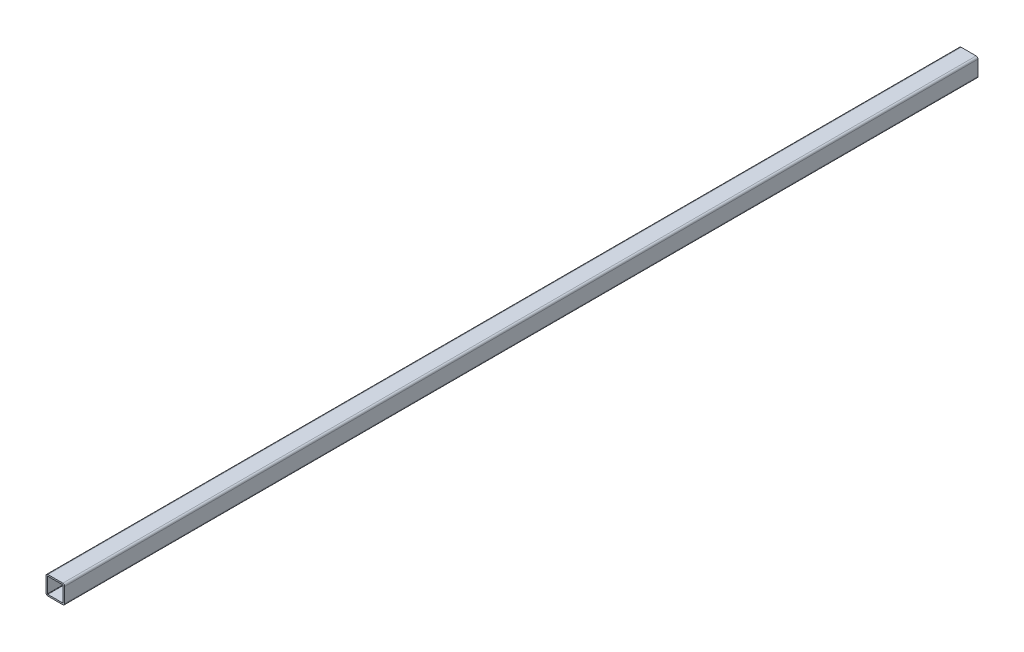
ISO-10303-21;
HEADER;
FILE_DESCRIPTION(('STEP AP214'),'2;1');
FILE_NAME('part.step','',(''),(''),'','','');
FILE_SCHEMA(('AUTOMOTIVE_DESIGN { 1 0 10303 214 1 1 1 1 }'));
ENDSEC;
DATA;
#1=APPLICATION_CONTEXT('core data for automotive mechanical design processes');
#2=APPLICATION_PROTOCOL_DEFINITION('international standard','automotive_design',2000,#1);
#3=PRODUCT_CONTEXT('',#1,'mechanical');
#4=PRODUCT('Part','Part','',(#3));
#5=PRODUCT_RELATED_PRODUCT_CATEGORY('part','',(#4));
#6=PRODUCT_DEFINITION_FORMATION('','',#4);
#7=PRODUCT_DEFINITION_CONTEXT('part definition',#1,'design');
#8=PRODUCT_DEFINITION('design','',#6,#7);
#9=PRODUCT_DEFINITION_SHAPE('','',#8);
#10=(LENGTH_UNIT() NAMED_UNIT(*) SI_UNIT(.MILLI.,.METRE.));
#11=(NAMED_UNIT(*) PLANE_ANGLE_UNIT() SI_UNIT($,.RADIAN.));
#12=(NAMED_UNIT(*) SI_UNIT($,.STERADIAN.) SOLID_ANGLE_UNIT());
#13=UNCERTAINTY_MEASURE_WITH_UNIT(LENGTH_MEASURE(1.E-05),#10,'distance_accuracy_value','');
#14=(GEOMETRIC_REPRESENTATION_CONTEXT(3) GLOBAL_UNCERTAINTY_ASSIGNED_CONTEXT((#13)) GLOBAL_UNIT_ASSIGNED_CONTEXT((#10,
#11,#12)) REPRESENTATION_CONTEXT('',''));
#15=CARTESIAN_POINT('',(0.,0.,0.));
#16=DIRECTION('',(0.,0.,1.));
#17=DIRECTION('',(1.,0.,0.));
#18=AXIS2_PLACEMENT_3D('',#15,#16,#17);
#19=CARTESIAN_POINT('',(-10.,10.,609.6));
#20=DIRECTION('',(0.,0.,1.));
#21=DIRECTION('',(1.,0.,0.));
#22=AXIS2_PLACEMENT_3D('',#19,#20,#21);
#23=PLANE('',#22);
#24=CARTESIAN_POINT('',(-10.,10.,609.6));
#25=DIRECTION('',(0.,0.,1.));
#26=DIRECTION('',(1.,0.,0.));
#27=AXIS2_PLACEMENT_3D('',#24,#25,#26);
#28=CIRCLE('',#27,2.5);
#29=CARTESIAN_POINT('',(-10.,12.5,609.6));
#30=VERTEX_POINT('',#29);
#31=CARTESIAN_POINT('',(-12.5,10.,609.6));
#32=VERTEX_POINT('',#31);
#33=EDGE_CURVE('E256',#30,#32,#28,.T.);
#34=ORIENTED_EDGE('',*,*,#33,.T.);
#35=DIRECTION('',(0.,-1.,0.));
#36=VECTOR('',#35,1.);
#37=CARTESIAN_POINT('',(-12.5,-10.,609.6));
#38=LINE('',#37,#36);
#39=CARTESIAN_POINT('',(-12.5,-10.,609.6));
#40=VERTEX_POINT('',#39);
#41=EDGE_CURVE('E259',#32,#40,#38,.T.);
#42=ORIENTED_EDGE('',*,*,#41,.T.);
#43=CARTESIAN_POINT('',(-10.,-10.,609.6));
#44=DIRECTION('',(0.,0.,1.));
#45=DIRECTION('',(-1.,0.,0.));
#46=AXIS2_PLACEMENT_3D('',#43,#44,#45);
#47=CIRCLE('',#46,2.5);
#48=CARTESIAN_POINT('',(-10.,-12.5,609.6));
#49=VERTEX_POINT('',#48);
#50=EDGE_CURVE('E262',#40,#49,#47,.T.);
#51=ORIENTED_EDGE('',*,*,#50,.T.);
#52=DIRECTION('',(1.,0.,0.));
#53=VECTOR('',#52,1.);
#54=CARTESIAN_POINT('',(10.,-12.5,609.6));
#55=LINE('',#54,#53);
#56=CARTESIAN_POINT('',(10.,-12.5,609.6));
#57=VERTEX_POINT('',#56);
#58=EDGE_CURVE('E264',#49,#57,#55,.T.);
#59=ORIENTED_EDGE('',*,*,#58,.T.);
#60=CARTESIAN_POINT('',(10.,-10.,609.6));
#61=DIRECTION('',(0.,0.,1.));
#62=DIRECTION('',(1.,0.,0.));
#63=AXIS2_PLACEMENT_3D('',#60,#61,#62);
#64=CIRCLE('',#63,2.5);
#65=CARTESIAN_POINT('',(12.5,-10.,609.6));
#66=VERTEX_POINT('',#65);
#67=EDGE_CURVE('E266',#57,#66,#64,.T.);
#68=ORIENTED_EDGE('',*,*,#67,.T.);
#69=DIRECTION('',(0.,1.,0.));
#70=VECTOR('',#69,1.);
#71=CARTESIAN_POINT('',(12.5,-10.,609.6));
#72=LINE('',#71,#70);
#73=CARTESIAN_POINT('',(12.5,10.,609.6));
#74=VERTEX_POINT('',#73);
#75=EDGE_CURVE('E268',#66,#74,#72,.T.);
#76=ORIENTED_EDGE('',*,*,#75,.T.);
#77=CARTESIAN_POINT('',(10.,10.,609.6));
#78=DIRECTION('',(0.,0.,1.));
#79=DIRECTION('',(1.,0.,0.));
#80=AXIS2_PLACEMENT_3D('',#77,#78,#79);
#81=CIRCLE('',#80,2.5);
#82=CARTESIAN_POINT('',(10.,12.5,609.6));
#83=VERTEX_POINT('',#82);
#84=EDGE_CURVE('E270',#74,#83,#81,.T.);
#85=ORIENTED_EDGE('',*,*,#84,.T.);
#86=DIRECTION('',(-1.,0.,0.));
#87=VECTOR('',#86,1.);
#88=CARTESIAN_POINT('',(10.,12.5,609.6));
#89=LINE('',#88,#87);
#90=EDGE_CURVE('E272',#83,#30,#89,.T.);
#91=ORIENTED_EDGE('',*,*,#90,.T.);
#92=EDGE_LOOP('',(#34,#42,#51,#59,#68,#76,#85,#91));
#93=FACE_BOUND('',#92,.T.);
#94=DIRECTION('',(0.,-1.,0.));
#95=VECTOR('',#94,1.);
#96=CARTESIAN_POINT('',(-10.5,-10.,609.6));
#97=LINE('',#96,#95);
#98=CARTESIAN_POINT('',(-10.5,10.,609.6));
#99=VERTEX_POINT('',#98);
#100=CARTESIAN_POINT('',(-10.5,-10.,609.6));
#101=VERTEX_POINT('',#100);
#102=EDGE_CURVE('E199',#99,#101,#97,.T.);
#103=ORIENTED_EDGE('',*,*,#102,.F.);
#104=CARTESIAN_POINT('',(-10.,10.,609.6));
#105=DIRECTION('',(0.,0.,1.));
#106=DIRECTION('',(1.,0.,0.));
#107=AXIS2_PLACEMENT_3D('',#104,#105,#106);
#108=CIRCLE('',#107,0.5);
#109=CARTESIAN_POINT('',(-10.,10.5,609.6));
#110=VERTEX_POINT('',#109);
#111=EDGE_CURVE('E191',#110,#99,#108,.T.);
#112=ORIENTED_EDGE('',*,*,#111,.F.);
#113=DIRECTION('',(-1.,0.,0.));
#114=VECTOR('',#113,1.);
#115=CARTESIAN_POINT('',(10.,10.5,609.6));
#116=LINE('',#115,#114);
#117=CARTESIAN_POINT('',(10.,10.5,609.6));
#118=VERTEX_POINT('',#117);
#119=EDGE_CURVE('E224',#118,#110,#116,.T.);
#120=ORIENTED_EDGE('',*,*,#119,.F.);
#121=CARTESIAN_POINT('',(10.,10.,609.6));
#122=DIRECTION('',(0.,0.,1.));
#123=DIRECTION('',(1.,0.,0.));
#124=AXIS2_PLACEMENT_3D('',#121,#122,#123);
#125=CIRCLE('',#124,0.499999999999997);
#126=CARTESIAN_POINT('',(10.5,10.,609.6));
#127=VERTEX_POINT('',#126);
#128=EDGE_CURVE('E222',#127,#118,#125,.T.);
#129=ORIENTED_EDGE('',*,*,#128,.F.);
#130=DIRECTION('',(0.,1.,0.));
#131=VECTOR('',#130,1.);
#132=CARTESIAN_POINT('',(10.5,-10.,609.6));
#133=LINE('',#132,#131);
#134=CARTESIAN_POINT('',(10.5,-10.,609.6));
#135=VERTEX_POINT('',#134);
#136=EDGE_CURVE('E220',#135,#127,#133,.T.);
#137=ORIENTED_EDGE('',*,*,#136,.F.);
#138=CARTESIAN_POINT('',(10.,-10.,609.6));
#139=DIRECTION('',(0.,0.,1.));
#140=DIRECTION('',(1.,0.,0.));
#141=AXIS2_PLACEMENT_3D('',#138,#139,#140);
#142=CIRCLE('',#141,0.499999999999999);
#143=CARTESIAN_POINT('',(10.,-10.5,609.6));
#144=VERTEX_POINT('',#143);
#145=EDGE_CURVE('E218',#144,#135,#142,.T.);
#146=ORIENTED_EDGE('',*,*,#145,.F.);
#147=DIRECTION('',(1.,0.,0.));
#148=VECTOR('',#147,1.);
#149=CARTESIAN_POINT('',(10.,-10.5,609.6));
#150=LINE('',#149,#148);
#151=CARTESIAN_POINT('',(-10.,-10.5,609.6));
#152=VERTEX_POINT('',#151);
#153=EDGE_CURVE('E214',#152,#144,#150,.T.);
#154=ORIENTED_EDGE('',*,*,#153,.F.);
#155=CARTESIAN_POINT('',(-10.,-10.,609.6));
#156=DIRECTION('',(0.,0.,1.));
#157=DIRECTION('',(1.,0.,0.));
#158=AXIS2_PLACEMENT_3D('',#155,#156,#157);
#159=CIRCLE('',#158,0.500000000000001);
#160=EDGE_CURVE('E212',#101,#152,#159,.T.);
#161=ORIENTED_EDGE('',*,*,#160,.F.);
#162=EDGE_LOOP('',(#103,#112,#120,#129,#137,#146,#154,#161));
#163=FACE_BOUND('',#162,.T.);
#164=ADVANCED_FACE('F78',(#93,#163),#23,.T.);
#165=CARTESIAN_POINT('',(-10.,10.,-609.6));
#166=DIRECTION('',(0.,0.,1.));
#167=DIRECTION('',(1.,0.,0.));
#168=AXIS2_PLACEMENT_3D('',#165,#166,#167);
#169=PLANE('',#168);
#170=CARTESIAN_POINT('',(-10.,10.,-609.6));
#171=DIRECTION('',(0.,0.,1.));
#172=DIRECTION('',(1.,0.,0.));
#173=AXIS2_PLACEMENT_3D('',#170,#171,#172);
#174=CIRCLE('',#173,2.5);
#175=CARTESIAN_POINT('',(-10.,12.5,-609.6));
#176=VERTEX_POINT('',#175);
#177=CARTESIAN_POINT('',(-12.5,10.,-609.6));
#178=VERTEX_POINT('',#177);
#179=EDGE_CURVE('E207',#176,#178,#174,.T.);
#180=ORIENTED_EDGE('',*,*,#179,.F.);
#181=DIRECTION('',(-1.,0.,0.));
#182=VECTOR('',#181,1.);
#183=CARTESIAN_POINT('',(10.,12.5,-609.6));
#184=LINE('',#183,#182);
#185=CARTESIAN_POINT('',(10.,12.5,-609.6));
#186=VERTEX_POINT('',#185);
#187=EDGE_CURVE('E260',#186,#176,#184,.T.);
#188=ORIENTED_EDGE('',*,*,#187,.F.);
#189=CARTESIAN_POINT('',(10.,10.,-609.6));
#190=DIRECTION('',(0.,0.,1.));
#191=DIRECTION('',(1.,0.,0.));
#192=AXIS2_PLACEMENT_3D('',#189,#190,#191);
#193=CIRCLE('',#192,2.5);
#194=CARTESIAN_POINT('',(12.5,10.,-609.6));
#195=VERTEX_POINT('',#194);
#196=EDGE_CURVE('E287',#195,#186,#193,.T.);
#197=ORIENTED_EDGE('',*,*,#196,.F.);
#198=DIRECTION('',(0.,1.,0.));
#199=VECTOR('',#198,1.);
#200=CARTESIAN_POINT('',(12.5,-10.,-609.6));
#201=LINE('',#200,#199);
#202=CARTESIAN_POINT('',(12.5,-10.,-609.6));
#203=VERTEX_POINT('',#202);
#204=EDGE_CURVE('E285',#203,#195,#201,.T.);
#205=ORIENTED_EDGE('',*,*,#204,.F.);
#206=CARTESIAN_POINT('',(10.,-10.,-609.6));
#207=DIRECTION('',(0.,0.,1.));
#208=DIRECTION('',(1.,0.,0.));
#209=AXIS2_PLACEMENT_3D('',#206,#207,#208);
#210=CIRCLE('',#209,2.5);
#211=CARTESIAN_POINT('',(10.,-12.5,-609.6));
#212=VERTEX_POINT('',#211);
#213=EDGE_CURVE('E283',#212,#203,#210,.T.);
#214=ORIENTED_EDGE('',*,*,#213,.F.);
#215=DIRECTION('',(1.,0.,0.));
#216=VECTOR('',#215,1.);
#217=CARTESIAN_POINT('',(10.,-12.5,-609.6));
#218=LINE('',#217,#216);
#219=CARTESIAN_POINT('',(-10.,-12.5,-609.6));
#220=VERTEX_POINT('',#219);
#221=EDGE_CURVE('E281',#220,#212,#218,.T.);
#222=ORIENTED_EDGE('',*,*,#221,.F.);
#223=CARTESIAN_POINT('',(-10.,-10.,-609.6));
#224=DIRECTION('',(0.,0.,1.));
#225=DIRECTION('',(-1.,0.,0.));
#226=AXIS2_PLACEMENT_3D('',#223,#224,#225);
#227=CIRCLE('',#226,2.5);
#228=CARTESIAN_POINT('',(-12.5,-10.,-609.6));
#229=VERTEX_POINT('',#228);
#230=EDGE_CURVE('E279',#229,#220,#227,.T.);
#231=ORIENTED_EDGE('',*,*,#230,.F.);
#232=DIRECTION('',(0.,-1.,0.));
#233=VECTOR('',#232,1.);
#234=CARTESIAN_POINT('',(-12.5,-10.,-609.6));
#235=LINE('',#234,#233);
#236=EDGE_CURVE('E277',#178,#229,#235,.T.);
#237=ORIENTED_EDGE('',*,*,#236,.F.);
#238=EDGE_LOOP('',(#180,#188,#197,#205,#214,#222,#231,#237));
#239=FACE_BOUND('',#238,.T.);
#240=CARTESIAN_POINT('',(-10.,10.,-609.6));
#241=DIRECTION('',(0.,0.,1.));
#242=DIRECTION('',(1.,0.,0.));
#243=AXIS2_PLACEMENT_3D('',#240,#241,#242);
#244=CIRCLE('',#243,0.5);
#245=CARTESIAN_POINT('',(-10.,10.5,-609.6));
#246=VERTEX_POINT('',#245);
#247=CARTESIAN_POINT('',(-10.5,10.,-609.6));
#248=VERTEX_POINT('',#247);
#249=EDGE_CURVE('E101',#246,#248,#244,.T.);
#250=ORIENTED_EDGE('',*,*,#249,.T.);
#251=DIRECTION('',(0.,-1.,0.));
#252=VECTOR('',#251,1.);
#253=CARTESIAN_POINT('',(-10.5,-10.,-609.6));
#254=LINE('',#253,#252);
#255=CARTESIAN_POINT('',(-10.5,-10.,-609.6));
#256=VERTEX_POINT('',#255);
#257=EDGE_CURVE('E206',#248,#256,#254,.T.);
#258=ORIENTED_EDGE('',*,*,#257,.T.);
#259=CARTESIAN_POINT('',(-10.,-10.,-609.6));
#260=DIRECTION('',(0.,0.,1.));
#261=DIRECTION('',(1.,0.,0.));
#262=AXIS2_PLACEMENT_3D('',#259,#260,#261);
#263=CIRCLE('',#262,0.500000000000001);
#264=CARTESIAN_POINT('',(-10.,-10.5,-609.6));
#265=VERTEX_POINT('',#264);
#266=EDGE_CURVE('E228',#256,#265,#263,.T.);
#267=ORIENTED_EDGE('',*,*,#266,.T.);
#268=DIRECTION('',(1.,0.,0.));
#269=VECTOR('',#268,1.);
#270=CARTESIAN_POINT('',(10.,-10.5,-609.6));
#271=LINE('',#270,#269);
#272=CARTESIAN_POINT('',(10.,-10.5,-609.6));
#273=VERTEX_POINT('',#272);
#274=EDGE_CURVE('E231',#265,#273,#271,.T.);
#275=ORIENTED_EDGE('',*,*,#274,.T.);
#276=CARTESIAN_POINT('',(10.,-10.,-609.6));
#277=DIRECTION('',(0.,0.,1.));
#278=DIRECTION('',(1.,0.,0.));
#279=AXIS2_PLACEMENT_3D('',#276,#277,#278);
#280=CIRCLE('',#279,0.499999999999999);
#281=CARTESIAN_POINT('',(10.5,-10.,-609.6));
#282=VERTEX_POINT('',#281);
#283=EDGE_CURVE('E234',#273,#282,#280,.T.);
#284=ORIENTED_EDGE('',*,*,#283,.T.);
#285=DIRECTION('',(0.,1.,0.));
#286=VECTOR('',#285,1.);
#287=CARTESIAN_POINT('',(10.5,-10.,-609.6));
#288=LINE('',#287,#286);
#289=CARTESIAN_POINT('',(10.5,10.,-609.6));
#290=VERTEX_POINT('',#289);
#291=EDGE_CURVE('E237',#282,#290,#288,.T.);
#292=ORIENTED_EDGE('',*,*,#291,.T.);
#293=CARTESIAN_POINT('',(10.,10.,-609.6));
#294=DIRECTION('',(0.,0.,1.));
#295=DIRECTION('',(1.,0.,0.));
#296=AXIS2_PLACEMENT_3D('',#293,#294,#295);
#297=CIRCLE('',#296,0.499999999999997);
#298=CARTESIAN_POINT('',(10.,10.5,-609.6));
#299=VERTEX_POINT('',#298);
#300=EDGE_CURVE('E240',#290,#299,#297,.T.);
#301=ORIENTED_EDGE('',*,*,#300,.T.);
#302=DIRECTION('',(-1.,0.,0.));
#303=VECTOR('',#302,1.);
#304=CARTESIAN_POINT('',(10.,10.5,-609.6));
#305=LINE('',#304,#303);
#306=EDGE_CURVE('E200',#299,#246,#305,.T.);
#307=ORIENTED_EDGE('',*,*,#306,.T.);
#308=EDGE_LOOP('',(#250,#258,#267,#275,#284,#292,#301,#307));
#309=FACE_BOUND('',#308,.T.);
#310=ADVANCED_FACE('F317',(#239,#309),#169,.F.);
#311=CARTESIAN_POINT('',(-10.,10.,609.6));
#312=DIRECTION('',(0.,0.,-1.));
#313=DIRECTION('',(-1.,0.,0.));
#314=AXIS2_PLACEMENT_3D('',#311,#312,#313);
#315=CYLINDRICAL_SURFACE('',#314,2.5);
#316=ORIENTED_EDGE('',*,*,#179,.T.);
#317=DIRECTION('',(0.,0.,-1.));
#318=VECTOR('',#317,1.);
#319=CARTESIAN_POINT('',(-12.5,10.,609.6));
#320=LINE('',#319,#318);
#321=EDGE_CURVE('E12',#32,#178,#320,.T.);
#322=ORIENTED_EDGE('',*,*,#321,.F.);
#323=ORIENTED_EDGE('',*,*,#33,.F.);
#324=DIRECTION('',(0.,0.,-1.));
#325=VECTOR('',#324,1.);
#326=CARTESIAN_POINT('',(-10.,12.5,609.6));
#327=LINE('',#326,#325);
#328=EDGE_CURVE('E274',#30,#176,#327,.T.);
#329=ORIENTED_EDGE('',*,*,#328,.T.);
#330=EDGE_LOOP('',(#316,#322,#323,#329));
#331=FACE_BOUND('',#330,.T.);
#332=ADVANCED_FACE('F80',(#331),#315,.T.);
#333=CARTESIAN_POINT('',(-12.5,-10.,609.6));
#334=DIRECTION('',(1.,0.,0.));
#335=DIRECTION('',(0.,0.,-1.));
#336=AXIS2_PLACEMENT_3D('',#333,#334,#335);
#337=PLANE('',#336);
#338=ORIENTED_EDGE('',*,*,#236,.T.);
#339=DIRECTION('',(0.,0.,-1.));
#340=VECTOR('',#339,1.);
#341=CARTESIAN_POINT('',(-12.5,-10.,609.6));
#342=LINE('',#341,#340);
#343=EDGE_CURVE('E86',#40,#229,#342,.T.);
#344=ORIENTED_EDGE('',*,*,#343,.F.);
#345=ORIENTED_EDGE('',*,*,#41,.F.);
#346=ORIENTED_EDGE('',*,*,#321,.T.);
#347=EDGE_LOOP('',(#338,#344,#345,#346));
#348=FACE_BOUND('',#347,.T.);
#349=ADVANCED_FACE('F334',(#348),#337,.F.);
#350=CARTESIAN_POINT('',(-10.,-10.,609.6));
#351=DIRECTION('',(0.,0.,-1.));
#352=DIRECTION('',(-1.,0.,0.));
#353=AXIS2_PLACEMENT_3D('',#350,#351,#352);
#354=CYLINDRICAL_SURFACE('',#353,2.5);
#355=ORIENTED_EDGE('',*,*,#230,.T.);
#356=DIRECTION('',(0.,0.,-1.));
#357=VECTOR('',#356,1.);
#358=CARTESIAN_POINT('',(-10.,-12.5,609.6));
#359=LINE('',#358,#357);
#360=EDGE_CURVE('E304',#49,#220,#359,.T.);
#361=ORIENTED_EDGE('',*,*,#360,.F.);
#362=ORIENTED_EDGE('',*,*,#50,.F.);
#363=ORIENTED_EDGE('',*,*,#343,.T.);
#364=EDGE_LOOP('',(#355,#361,#362,#363));
#365=FACE_BOUND('',#364,.T.);
#366=ADVANCED_FACE('F311',(#365),#354,.T.);
#367=CARTESIAN_POINT('',(10.,-12.5,609.6));
#368=DIRECTION('',(0.,1.,0.));
#369=DIRECTION('',(-1.,0.,0.));
#370=AXIS2_PLACEMENT_3D('',#367,#368,#369);
#371=PLANE('',#370);
#372=ORIENTED_EDGE('',*,*,#221,.T.);
#373=DIRECTION('',(0.,0.,-1.));
#374=VECTOR('',#373,1.);
#375=CARTESIAN_POINT('',(10.,-12.5,609.6));
#376=LINE('',#375,#374);
#377=EDGE_CURVE('E301',#57,#212,#376,.T.);
#378=ORIENTED_EDGE('',*,*,#377,.F.);
#379=ORIENTED_EDGE('',*,*,#58,.F.);
#380=ORIENTED_EDGE('',*,*,#360,.T.);
#381=EDGE_LOOP('',(#372,#378,#379,#380));
#382=FACE_BOUND('',#381,.T.);
#383=ADVANCED_FACE('F323',(#382),#371,.F.);
#384=CARTESIAN_POINT('',(10.,-10.,609.6));
#385=DIRECTION('',(0.,0.,-1.));
#386=DIRECTION('',(-1.,0.,0.));
#387=AXIS2_PLACEMENT_3D('',#384,#385,#386);
#388=CYLINDRICAL_SURFACE('',#387,2.5);
#389=ORIENTED_EDGE('',*,*,#213,.T.);
#390=DIRECTION('',(0.,0.,-1.));
#391=VECTOR('',#390,1.);
#392=CARTESIAN_POINT('',(12.5,-10.,609.6));
#393=LINE('',#392,#391);
#394=EDGE_CURVE('E298',#66,#203,#393,.T.);
#395=ORIENTED_EDGE('',*,*,#394,.F.);
#396=ORIENTED_EDGE('',*,*,#67,.F.);
#397=ORIENTED_EDGE('',*,*,#377,.T.);
#398=EDGE_LOOP('',(#389,#395,#396,#397));
#399=FACE_BOUND('',#398,.T.);
#400=ADVANCED_FACE('F327',(#399),#388,.T.);
#401=CARTESIAN_POINT('',(12.5,-10.,609.6));
#402=DIRECTION('',(-1.,0.,0.));
#403=DIRECTION('',(0.,-1.,0.));
#404=AXIS2_PLACEMENT_3D('',#401,#402,#403);
#405=PLANE('',#404);
#406=ORIENTED_EDGE('',*,*,#204,.T.);
#407=DIRECTION('',(0.,0.,-1.));
#408=VECTOR('',#407,1.);
#409=CARTESIAN_POINT('',(12.5,10.,609.6));
#410=LINE('',#409,#408);
#411=EDGE_CURVE('E295',#74,#195,#410,.T.);
#412=ORIENTED_EDGE('',*,*,#411,.F.);
#413=ORIENTED_EDGE('',*,*,#75,.F.);
#414=ORIENTED_EDGE('',*,*,#394,.T.);
#415=EDGE_LOOP('',(#406,#412,#413,#414));
#416=FACE_BOUND('',#415,.T.);
#417=ADVANCED_FACE('F347',(#416),#405,.F.);
#418=CARTESIAN_POINT('',(10.,10.,609.6));
#419=DIRECTION('',(0.,0.,-1.));
#420=DIRECTION('',(-1.,0.,0.));
#421=AXIS2_PLACEMENT_3D('',#418,#419,#420);
#422=CYLINDRICAL_SURFACE('',#421,2.5);
#423=ORIENTED_EDGE('',*,*,#196,.T.);
#424=DIRECTION('',(0.,0.,-1.));
#425=VECTOR('',#424,1.);
#426=CARTESIAN_POINT('',(10.,12.5,609.6));
#427=LINE('',#426,#425);
#428=EDGE_CURVE('E292',#83,#186,#427,.T.);
#429=ORIENTED_EDGE('',*,*,#428,.F.);
#430=ORIENTED_EDGE('',*,*,#84,.F.);
#431=ORIENTED_EDGE('',*,*,#411,.T.);
#432=EDGE_LOOP('',(#423,#429,#430,#431));
#433=FACE_BOUND('',#432,.T.);
#434=ADVANCED_FACE('F345',(#433),#422,.T.);
#435=CARTESIAN_POINT('',(10.,12.5,609.6));
#436=DIRECTION('',(0.,-1.,0.));
#437=DIRECTION('',(1.,0.,0.));
#438=AXIS2_PLACEMENT_3D('',#435,#436,#437);
#439=PLANE('',#438);
#440=ORIENTED_EDGE('',*,*,#187,.T.);
#441=ORIENTED_EDGE('',*,*,#328,.F.);
#442=ORIENTED_EDGE('',*,*,#90,.F.);
#443=ORIENTED_EDGE('',*,*,#428,.T.);
#444=EDGE_LOOP('',(#440,#441,#442,#443));
#445=FACE_BOUND('',#444,.T.);
#446=ADVANCED_FACE('F340',(#445),#439,.F.);
#447=CARTESIAN_POINT('',(-10.,10.,609.6));
#448=DIRECTION('',(0.,0.,-1.));
#449=DIRECTION('',(-1.,0.,0.));
#450=AXIS2_PLACEMENT_3D('',#447,#448,#449);
#451=CYLINDRICAL_SURFACE('',#450,0.5);
#452=ORIENTED_EDGE('',*,*,#249,.F.);
#453=DIRECTION('',(0.,0.,-1.));
#454=VECTOR('',#453,1.);
#455=CARTESIAN_POINT('',(-10.,10.5,609.6));
#456=LINE('',#455,#454);
#457=EDGE_CURVE('E195',#110,#246,#456,.T.);
#458=ORIENTED_EDGE('',*,*,#457,.F.);
#459=ORIENTED_EDGE('',*,*,#111,.T.);
#460=DIRECTION('',(0.,0.,-1.));
#461=VECTOR('',#460,1.);
#462=CARTESIAN_POINT('',(-10.5,10.,609.6));
#463=LINE('',#462,#461);
#464=EDGE_CURVE('E194',#99,#248,#463,.T.);
#465=ORIENTED_EDGE('',*,*,#464,.T.);
#466=EDGE_LOOP('',(#452,#458,#459,#465));
#467=FACE_BOUND('',#466,.T.);
#468=ADVANCED_FACE('F193',(#467),#451,.F.);
#469=CARTESIAN_POINT('',(-10.5,-10.,609.6));
#470=DIRECTION('',(1.,0.,0.));
#471=DIRECTION('',(0.,0.,-1.));
#472=AXIS2_PLACEMENT_3D('',#469,#470,#471);
#473=PLANE('',#472);
#474=ORIENTED_EDGE('',*,*,#257,.F.);
#475=ORIENTED_EDGE('',*,*,#464,.F.);
#476=ORIENTED_EDGE('',*,*,#102,.T.);
#477=DIRECTION('',(0.,0.,-1.));
#478=VECTOR('',#477,1.);
#479=CARTESIAN_POINT('',(-10.5,-10.,609.6));
#480=LINE('',#479,#478);
#481=EDGE_CURVE('E208',#101,#256,#480,.T.);
#482=ORIENTED_EDGE('',*,*,#481,.T.);
#483=EDGE_LOOP('',(#474,#475,#476,#482));
#484=FACE_BOUND('',#483,.T.);
#485=ADVANCED_FACE('F203',(#484),#473,.T.);
#486=CARTESIAN_POINT('',(-10.,-10.,609.6));
#487=DIRECTION('',(0.,0.,-1.));
#488=DIRECTION('',(-1.,0.,0.));
#489=AXIS2_PLACEMENT_3D('',#486,#487,#488);
#490=CYLINDRICAL_SURFACE('',#489,0.500000000000001);
#491=ORIENTED_EDGE('',*,*,#266,.F.);
#492=ORIENTED_EDGE('',*,*,#481,.F.);
#493=ORIENTED_EDGE('',*,*,#160,.T.);
#494=DIRECTION('',(0.,0.,-1.));
#495=VECTOR('',#494,1.);
#496=CARTESIAN_POINT('',(-10.,-10.5,609.6));
#497=LINE('',#496,#495);
#498=EDGE_CURVE('E253',#152,#265,#497,.T.);
#499=ORIENTED_EDGE('',*,*,#498,.T.);
#500=EDGE_LOOP('',(#491,#492,#493,#499));
#501=FACE_BOUND('',#500,.T.);
#502=ADVANCED_FACE('F372',(#501),#490,.F.);
#503=CARTESIAN_POINT('',(10.,-10.5,609.6));
#504=DIRECTION('',(0.,1.,0.));
#505=DIRECTION('',(-1.,0.,0.));
#506=AXIS2_PLACEMENT_3D('',#503,#504,#505);
#507=PLANE('',#506);
#508=ORIENTED_EDGE('',*,*,#274,.F.);
#509=ORIENTED_EDGE('',*,*,#498,.F.);
#510=ORIENTED_EDGE('',*,*,#153,.T.);
#511=DIRECTION('',(0.,0.,-1.));
#512=VECTOR('',#511,1.);
#513=CARTESIAN_POINT('',(10.,-10.5,609.6));
#514=LINE('',#513,#512);
#515=EDGE_CURVE('E251',#144,#273,#514,.T.);
#516=ORIENTED_EDGE('',*,*,#515,.T.);
#517=EDGE_LOOP('',(#508,#509,#510,#516));
#518=FACE_BOUND('',#517,.T.);
#519=ADVANCED_FACE('F376',(#518),#507,.T.);
#520=CARTESIAN_POINT('',(10.,-10.,609.6));
#521=DIRECTION('',(0.,0.,-1.));
#522=DIRECTION('',(-1.,0.,0.));
#523=AXIS2_PLACEMENT_3D('',#520,#521,#522);
#524=CYLINDRICAL_SURFACE('',#523,0.499999999999999);
#525=ORIENTED_EDGE('',*,*,#283,.F.);
#526=ORIENTED_EDGE('',*,*,#515,.F.);
#527=ORIENTED_EDGE('',*,*,#145,.T.);
#528=DIRECTION('',(0.,0.,-1.));
#529=VECTOR('',#528,1.);
#530=CARTESIAN_POINT('',(10.5,-10.,609.6));
#531=LINE('',#530,#529);
#532=EDGE_CURVE('E249',#135,#282,#531,.T.);
#533=ORIENTED_EDGE('',*,*,#532,.T.);
#534=EDGE_LOOP('',(#525,#526,#527,#533));
#535=FACE_BOUND('',#534,.T.);
#536=ADVANCED_FACE('F382',(#535),#524,.F.);
#537=CARTESIAN_POINT('',(10.5,-10.,609.6));
#538=DIRECTION('',(-1.,0.,0.));
#539=DIRECTION('',(0.,-1.,0.));
#540=AXIS2_PLACEMENT_3D('',#537,#538,#539);
#541=PLANE('',#540);
#542=ORIENTED_EDGE('',*,*,#291,.F.);
#543=ORIENTED_EDGE('',*,*,#532,.F.);
#544=ORIENTED_EDGE('',*,*,#136,.T.);
#545=DIRECTION('',(0.,0.,-1.));
#546=VECTOR('',#545,1.);
#547=CARTESIAN_POINT('',(10.5,10.,609.6));
#548=LINE('',#547,#546);
#549=EDGE_CURVE('E247',#127,#290,#548,.T.);
#550=ORIENTED_EDGE('',*,*,#549,.T.);
#551=EDGE_LOOP('',(#542,#543,#544,#550));
#552=FACE_BOUND('',#551,.T.);
#553=ADVANCED_FACE('F386',(#552),#541,.T.);
#554=CARTESIAN_POINT('',(10.,10.,609.6));
#555=DIRECTION('',(0.,0.,-1.));
#556=DIRECTION('',(-1.,0.,0.));
#557=AXIS2_PLACEMENT_3D('',#554,#555,#556);
#558=CYLINDRICAL_SURFACE('',#557,0.499999999999997);
#559=ORIENTED_EDGE('',*,*,#300,.F.);
#560=ORIENTED_EDGE('',*,*,#549,.F.);
#561=ORIENTED_EDGE('',*,*,#128,.T.);
#562=DIRECTION('',(0.,0.,-1.));
#563=VECTOR('',#562,1.);
#564=CARTESIAN_POINT('',(10.,10.5,609.6));
#565=LINE('',#564,#563);
#566=EDGE_CURVE('E93',#118,#299,#565,.T.);
#567=ORIENTED_EDGE('',*,*,#566,.T.);
#568=EDGE_LOOP('',(#559,#560,#561,#567));
#569=FACE_BOUND('',#568,.T.);
#570=ADVANCED_FACE('F390',(#569),#558,.F.);
#571=CARTESIAN_POINT('',(10.,10.5,609.6));
#572=DIRECTION('',(0.,-1.,0.));
#573=DIRECTION('',(1.,0.,0.));
#574=AXIS2_PLACEMENT_3D('',#571,#572,#573);
#575=PLANE('',#574);
#576=ORIENTED_EDGE('',*,*,#306,.F.);
#577=ORIENTED_EDGE('',*,*,#566,.F.);
#578=ORIENTED_EDGE('',*,*,#119,.T.);
#579=ORIENTED_EDGE('',*,*,#457,.T.);
#580=EDGE_LOOP('',(#576,#577,#578,#579));
#581=FACE_BOUND('',#580,.T.);
#582=ADVANCED_FACE('F394',(#581),#575,.T.);
#583=CLOSED_SHELL('',(#164,#310,#332,#349,#366,#383,#400,#417,#434,#446,#468,#485,#502,#519,
#536,#553,#570,#582));
#584=MANIFOLD_SOLID_BREP('B2',#583);
#585=ADVANCED_BREP_SHAPE_REPRESENTATION('',(#18,#584),#14);
#586=SHAPE_DEFINITION_REPRESENTATION(#9,#585);
ENDSEC;
END-ISO-10303-21;
